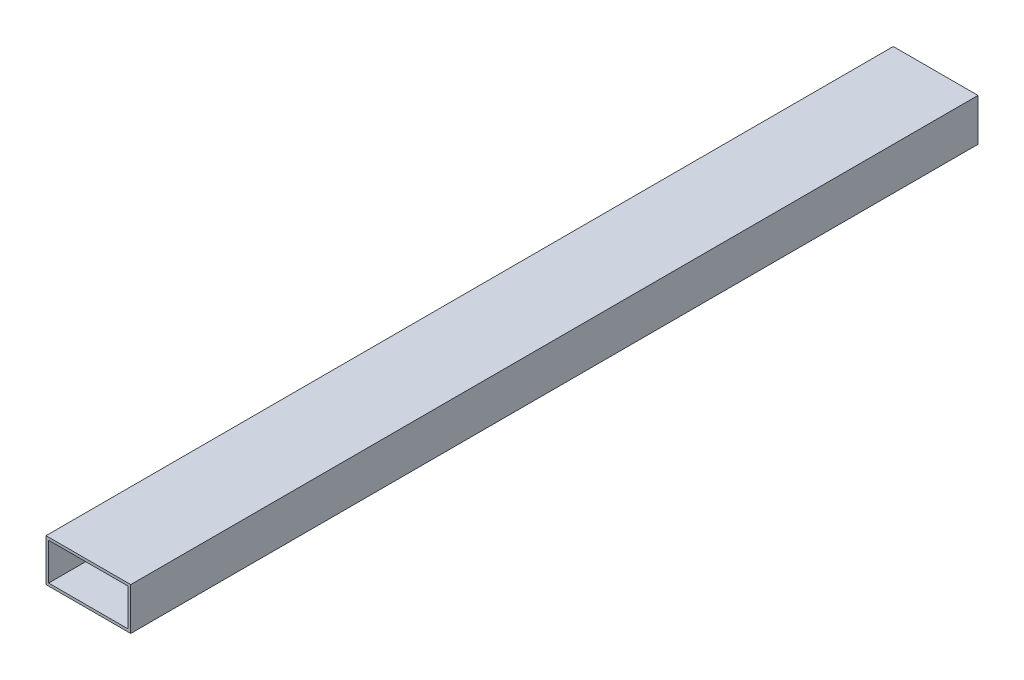
ISO-10303-21;
HEADER;
FILE_DESCRIPTION(('STEP AP214'),'2;1');
FILE_NAME('part.step','',(''),(''),'','','');
FILE_SCHEMA(('AUTOMOTIVE_DESIGN { 1 0 10303 214 1 1 1 1 }'));
ENDSEC;
DATA;
#1=APPLICATION_CONTEXT('core data for automotive mechanical design processes');
#2=APPLICATION_PROTOCOL_DEFINITION('international standard','automotive_design',2000,#1);
#3=PRODUCT_CONTEXT('',#1,'mechanical');
#4=PRODUCT('Part','Part','',(#3));
#5=PRODUCT_RELATED_PRODUCT_CATEGORY('part','',(#4));
#6=PRODUCT_DEFINITION_FORMATION('','',#4);
#7=PRODUCT_DEFINITION_CONTEXT('part definition',#1,'design');
#8=PRODUCT_DEFINITION('design','',#6,#7);
#9=PRODUCT_DEFINITION_SHAPE('','',#8);
#10=(LENGTH_UNIT() NAMED_UNIT(*) SI_UNIT(.MILLI.,.METRE.));
#11=(NAMED_UNIT(*) PLANE_ANGLE_UNIT() SI_UNIT($,.RADIAN.));
#12=(NAMED_UNIT(*) SI_UNIT($,.STERADIAN.) SOLID_ANGLE_UNIT());
#13=UNCERTAINTY_MEASURE_WITH_UNIT(LENGTH_MEASURE(1.E-05),#10,'distance_accuracy_value','');
#14=(GEOMETRIC_REPRESENTATION_CONTEXT(3) GLOBAL_UNCERTAINTY_ASSIGNED_CONTEXT((#13)) GLOBAL_UNIT_ASSIGNED_CONTEXT((#10,
#11,#12)) REPRESENTATION_CONTEXT('',''));
#15=CARTESIAN_POINT('',(0.,0.,0.));
#16=DIRECTION('',(0.,0.,1.));
#17=DIRECTION('',(1.,0.,0.));
#18=AXIS2_PLACEMENT_3D('',#15,#16,#17);
#19=CARTESIAN_POINT('',(0.,0.,508.));
#20=DIRECTION('',(0.,0.,-1.));
#21=DIRECTION('',(-1.,0.,0.));
#22=AXIS2_PLACEMENT_3D('',#19,#20,#21);
#23=PLANE('',#22);
#24=DIRECTION('',(0.,-1.,0.));
#25=VECTOR('',#24,1.);
#26=CARTESIAN_POINT('',(0.,0.,508.));
#27=LINE('',#26,#25);
#28=CARTESIAN_POINT('',(0.,25.4,508.));
#29=VERTEX_POINT('',#28);
#30=CARTESIAN_POINT('',(0.,0.,508.));
#31=VERTEX_POINT('',#30);
#32=EDGE_CURVE('E136',#29,#31,#27,.T.);
#33=ORIENTED_EDGE('',*,*,#32,.T.);
#34=DIRECTION('',(1.,0.,0.));
#35=VECTOR('',#34,1.);
#36=CARTESIAN_POINT('',(0.,0.,508.));
#37=LINE('',#36,#35);
#38=CARTESIAN_POINT('',(50.8,0.,508.));
#39=VERTEX_POINT('',#38);
#40=EDGE_CURVE('E139',#31,#39,#37,.T.);
#41=ORIENTED_EDGE('',*,*,#40,.T.);
#42=DIRECTION('',(0.,1.,0.));
#43=VECTOR('',#42,1.);
#44=CARTESIAN_POINT('',(50.8,0.,508.));
#45=LINE('',#44,#43);
#46=CARTESIAN_POINT('',(50.8,25.4,508.));
#47=VERTEX_POINT('',#46);
#48=EDGE_CURVE('E142',#39,#47,#45,.T.);
#49=ORIENTED_EDGE('',*,*,#48,.T.);
#50=DIRECTION('',(-1.,0.,0.));
#51=VECTOR('',#50,1.);
#52=CARTESIAN_POINT('',(0.,25.4,508.));
#53=LINE('',#52,#51);
#54=EDGE_CURVE('E144',#47,#29,#53,.T.);
#55=ORIENTED_EDGE('',*,*,#54,.T.);
#56=EDGE_LOOP('',(#33,#41,#49,#55));
#57=FACE_BOUND('',#56,.T.);
#58=DIRECTION('',(0.,-1.,0.));
#59=VECTOR('',#58,1.);
#60=CARTESIAN_POINT('',(1.5875,1.5875,508.));
#61=LINE('',#60,#59);
#62=CARTESIAN_POINT('',(1.5875,23.8125,508.));
#63=VERTEX_POINT('',#62);
#64=CARTESIAN_POINT('',(1.5875,1.5875,508.));
#65=VERTEX_POINT('',#64);
#66=EDGE_CURVE('E100',#63,#65,#61,.T.);
#67=ORIENTED_EDGE('',*,*,#66,.F.);
#68=DIRECTION('',(-1.,0.,0.));
#69=VECTOR('',#68,1.);
#70=CARTESIAN_POINT('',(1.5875,23.8125,508.));
#71=LINE('',#70,#69);
#72=CARTESIAN_POINT('',(49.2125,23.8125,508.));
#73=VERTEX_POINT('',#72);
#74=EDGE_CURVE('E122',#73,#63,#71,.T.);
#75=ORIENTED_EDGE('',*,*,#74,.F.);
#76=DIRECTION('',(0.,1.,0.));
#77=VECTOR('',#76,1.);
#78=CARTESIAN_POINT('',(49.2125,1.5875,508.));
#79=LINE('',#78,#77);
#80=CARTESIAN_POINT('',(49.2125,1.5875,508.));
#81=VERTEX_POINT('',#80);
#82=EDGE_CURVE('E120',#81,#73,#79,.T.);
#83=ORIENTED_EDGE('',*,*,#82,.F.);
#84=DIRECTION('',(1.,0.,0.));
#85=VECTOR('',#84,1.);
#86=CARTESIAN_POINT('',(1.5875,1.5875,508.));
#87=LINE('',#86,#85);
#88=EDGE_CURVE('E108',#65,#81,#87,.T.);
#89=ORIENTED_EDGE('',*,*,#88,.F.);
#90=EDGE_LOOP('',(#67,#75,#83,#89));
#91=FACE_BOUND('',#90,.T.);
#92=ADVANCED_FACE('F35',(#57,#91),#23,.F.);
#93=CARTESIAN_POINT('',(0.,0.,0.));
#94=DIRECTION('',(0.,0.,-1.));
#95=DIRECTION('',(-1.,0.,0.));
#96=AXIS2_PLACEMENT_3D('',#93,#94,#95);
#97=PLANE('',#96);
#98=DIRECTION('',(0.,-1.,0.));
#99=VECTOR('',#98,1.);
#100=CARTESIAN_POINT('',(0.,0.,0.));
#101=LINE('',#100,#99);
#102=CARTESIAN_POINT('',(0.,25.4,0.));
#103=VERTEX_POINT('',#102);
#104=CARTESIAN_POINT('',(0.,0.,0.));
#105=VERTEX_POINT('',#104);
#106=EDGE_CURVE('E116',#103,#105,#101,.T.);
#107=ORIENTED_EDGE('',*,*,#106,.F.);
#108=DIRECTION('',(-1.,0.,0.));
#109=VECTOR('',#108,1.);
#110=CARTESIAN_POINT('',(0.,25.4,0.));
#111=LINE('',#110,#109);
#112=CARTESIAN_POINT('',(50.8,25.4,0.));
#113=VERTEX_POINT('',#112);
#114=EDGE_CURVE('E140',#113,#103,#111,.T.);
#115=ORIENTED_EDGE('',*,*,#114,.F.);
#116=DIRECTION('',(0.,1.,0.));
#117=VECTOR('',#116,1.);
#118=CARTESIAN_POINT('',(50.8,0.,0.));
#119=LINE('',#118,#117);
#120=CARTESIAN_POINT('',(50.8,0.,0.));
#121=VERTEX_POINT('',#120);
#122=EDGE_CURVE('E151',#121,#113,#119,.T.);
#123=ORIENTED_EDGE('',*,*,#122,.F.);
#124=DIRECTION('',(1.,0.,0.));
#125=VECTOR('',#124,1.);
#126=CARTESIAN_POINT('',(0.,0.,0.));
#127=LINE('',#126,#125);
#128=EDGE_CURVE('E149',#105,#121,#127,.T.);
#129=ORIENTED_EDGE('',*,*,#128,.F.);
#130=EDGE_LOOP('',(#107,#115,#123,#129));
#131=FACE_BOUND('',#130,.T.);
#132=DIRECTION('',(-1.,0.,0.));
#133=VECTOR('',#132,1.);
#134=CARTESIAN_POINT('',(1.5875,23.8125,0.));
#135=LINE('',#134,#133);
#136=CARTESIAN_POINT('',(49.2125,23.8125,0.));
#137=VERTEX_POINT('',#136);
#138=CARTESIAN_POINT('',(1.5875,23.8125,0.));
#139=VERTEX_POINT('',#138);
#140=EDGE_CURVE('E109',#137,#139,#135,.T.);
#141=ORIENTED_EDGE('',*,*,#140,.T.);
#142=DIRECTION('',(0.,-1.,0.));
#143=VECTOR('',#142,1.);
#144=CARTESIAN_POINT('',(1.5875,1.5875,0.));
#145=LINE('',#144,#143);
#146=CARTESIAN_POINT('',(1.5875,1.5875,0.));
#147=VERTEX_POINT('',#146);
#148=EDGE_CURVE('E58',#139,#147,#145,.T.);
#149=ORIENTED_EDGE('',*,*,#148,.T.);
#150=DIRECTION('',(1.,0.,0.));
#151=VECTOR('',#150,1.);
#152=CARTESIAN_POINT('',(1.5875,1.5875,0.));
#153=LINE('',#152,#151);
#154=CARTESIAN_POINT('',(49.2125,1.5875,0.));
#155=VERTEX_POINT('',#154);
#156=EDGE_CURVE('E115',#147,#155,#153,.T.);
#157=ORIENTED_EDGE('',*,*,#156,.T.);
#158=DIRECTION('',(0.,1.,0.));
#159=VECTOR('',#158,1.);
#160=CARTESIAN_POINT('',(49.2125,1.5875,0.));
#161=LINE('',#160,#159);
#162=EDGE_CURVE('E128',#155,#137,#161,.T.);
#163=ORIENTED_EDGE('',*,*,#162,.T.);
#164=EDGE_LOOP('',(#141,#149,#157,#163));
#165=FACE_BOUND('',#164,.T.);
#166=ADVANCED_FACE('F169',(#131,#165),#97,.T.);
#167=CARTESIAN_POINT('',(0.,0.,508.));
#168=DIRECTION('',(1.,0.,0.));
#169=DIRECTION('',(0.,0.,-1.));
#170=AXIS2_PLACEMENT_3D('',#167,#168,#169);
#171=PLANE('',#170);
#172=ORIENTED_EDGE('',*,*,#106,.T.);
#173=DIRECTION('',(0.,0.,-1.));
#174=VECTOR('',#173,1.);
#175=CARTESIAN_POINT('',(0.,0.,508.));
#176=LINE('',#175,#174);
#177=EDGE_CURVE('E11',#31,#105,#176,.T.);
#178=ORIENTED_EDGE('',*,*,#177,.F.);
#179=ORIENTED_EDGE('',*,*,#32,.F.);
#180=DIRECTION('',(0.,0.,-1.));
#181=VECTOR('',#180,1.);
#182=CARTESIAN_POINT('',(0.,25.4,508.));
#183=LINE('',#182,#181);
#184=EDGE_CURVE('E146',#29,#103,#183,.T.);
#185=ORIENTED_EDGE('',*,*,#184,.T.);
#186=EDGE_LOOP('',(#172,#178,#179,#185));
#187=FACE_BOUND('',#186,.T.);
#188=ADVANCED_FACE('F37',(#187),#171,.F.);
#189=CARTESIAN_POINT('',(0.,0.,508.));
#190=DIRECTION('',(0.,1.,0.));
#191=DIRECTION('',(0.,0.,1.));
#192=AXIS2_PLACEMENT_3D('',#189,#190,#191);
#193=PLANE('',#192);
#194=ORIENTED_EDGE('',*,*,#128,.T.);
#195=DIRECTION('',(0.,0.,-1.));
#196=VECTOR('',#195,1.);
#197=CARTESIAN_POINT('',(50.8,0.,508.));
#198=LINE('',#197,#196);
#199=EDGE_CURVE('E43',#39,#121,#198,.T.);
#200=ORIENTED_EDGE('',*,*,#199,.F.);
#201=ORIENTED_EDGE('',*,*,#40,.F.);
#202=ORIENTED_EDGE('',*,*,#177,.T.);
#203=EDGE_LOOP('',(#194,#200,#201,#202));
#204=FACE_BOUND('',#203,.T.);
#205=ADVANCED_FACE('F179',(#204),#193,.F.);
#206=CARTESIAN_POINT('',(50.8,0.,508.));
#207=DIRECTION('',(-1.,0.,0.));
#208=DIRECTION('',(0.,0.,1.));
#209=AXIS2_PLACEMENT_3D('',#206,#207,#208);
#210=PLANE('',#209);
#211=ORIENTED_EDGE('',*,*,#122,.T.);
#212=DIRECTION('',(0.,0.,-1.));
#213=VECTOR('',#212,1.);
#214=CARTESIAN_POINT('',(50.8,25.4,508.));
#215=LINE('',#214,#213);
#216=EDGE_CURVE('E156',#47,#113,#215,.T.);
#217=ORIENTED_EDGE('',*,*,#216,.F.);
#218=ORIENTED_EDGE('',*,*,#48,.F.);
#219=ORIENTED_EDGE('',*,*,#199,.T.);
#220=EDGE_LOOP('',(#211,#217,#218,#219));
#221=FACE_BOUND('',#220,.T.);
#222=ADVANCED_FACE('F163',(#221),#210,.F.);
#223=CARTESIAN_POINT('',(0.,25.4,508.));
#224=DIRECTION('',(0.,-1.,0.));
#225=DIRECTION('',(0.,0.,-1.));
#226=AXIS2_PLACEMENT_3D('',#223,#224,#225);
#227=PLANE('',#226);
#228=ORIENTED_EDGE('',*,*,#114,.T.);
#229=ORIENTED_EDGE('',*,*,#184,.F.);
#230=ORIENTED_EDGE('',*,*,#54,.F.);
#231=ORIENTED_EDGE('',*,*,#216,.T.);
#232=EDGE_LOOP('',(#228,#229,#230,#231));
#233=FACE_BOUND('',#232,.T.);
#234=ADVANCED_FACE('F173',(#233),#227,.F.);
#235=CARTESIAN_POINT('',(1.5875,1.5875,508.));
#236=DIRECTION('',(1.,0.,0.));
#237=DIRECTION('',(0.,0.,-1.));
#238=AXIS2_PLACEMENT_3D('',#235,#236,#237);
#239=PLANE('',#238);
#240=ORIENTED_EDGE('',*,*,#148,.F.);
#241=DIRECTION('',(0.,0.,-1.));
#242=VECTOR('',#241,1.);
#243=CARTESIAN_POINT('',(1.5875,23.8125,508.));
#244=LINE('',#243,#242);
#245=EDGE_CURVE('E104',#63,#139,#244,.T.);
#246=ORIENTED_EDGE('',*,*,#245,.F.);
#247=ORIENTED_EDGE('',*,*,#66,.T.);
#248=DIRECTION('',(0.,0.,-1.));
#249=VECTOR('',#248,1.);
#250=CARTESIAN_POINT('',(1.5875,1.5875,508.));
#251=LINE('',#250,#249);
#252=EDGE_CURVE('E103',#65,#147,#251,.T.);
#253=ORIENTED_EDGE('',*,*,#252,.T.);
#254=EDGE_LOOP('',(#240,#246,#247,#253));
#255=FACE_BOUND('',#254,.T.);
#256=ADVANCED_FACE('F102',(#255),#239,.T.);
#257=CARTESIAN_POINT('',(1.5875,1.5875,508.));
#258=DIRECTION('',(0.,1.,0.));
#259=DIRECTION('',(0.,0.,1.));
#260=AXIS2_PLACEMENT_3D('',#257,#258,#259);
#261=PLANE('',#260);
#262=ORIENTED_EDGE('',*,*,#156,.F.);
#263=ORIENTED_EDGE('',*,*,#252,.F.);
#264=ORIENTED_EDGE('',*,*,#88,.T.);
#265=DIRECTION('',(0.,0.,-1.));
#266=VECTOR('',#265,1.);
#267=CARTESIAN_POINT('',(49.2125,1.5875,508.));
#268=LINE('',#267,#266);
#269=EDGE_CURVE('E117',#81,#155,#268,.T.);
#270=ORIENTED_EDGE('',*,*,#269,.T.);
#271=EDGE_LOOP('',(#262,#263,#264,#270));
#272=FACE_BOUND('',#271,.T.);
#273=ADVANCED_FACE('F112',(#272),#261,.T.);
#274=CARTESIAN_POINT('',(49.2125,1.5875,508.));
#275=DIRECTION('',(-1.,0.,0.));
#276=DIRECTION('',(0.,0.,1.));
#277=AXIS2_PLACEMENT_3D('',#274,#275,#276);
#278=PLANE('',#277);
#279=ORIENTED_EDGE('',*,*,#162,.F.);
#280=ORIENTED_EDGE('',*,*,#269,.F.);
#281=ORIENTED_EDGE('',*,*,#82,.T.);
#282=DIRECTION('',(0.,0.,-1.));
#283=VECTOR('',#282,1.);
#284=CARTESIAN_POINT('',(49.2125,23.8125,508.));
#285=LINE('',#284,#283);
#286=EDGE_CURVE('E50',#73,#137,#285,.T.);
#287=ORIENTED_EDGE('',*,*,#286,.T.);
#288=EDGE_LOOP('',(#279,#280,#281,#287));
#289=FACE_BOUND('',#288,.T.);
#290=ADVANCED_FACE('F202',(#289),#278,.T.);
#291=CARTESIAN_POINT('',(1.5875,23.8125,508.));
#292=DIRECTION('',(0.,-1.,0.));
#293=DIRECTION('',(0.,0.,-1.));
#294=AXIS2_PLACEMENT_3D('',#291,#292,#293);
#295=PLANE('',#294);
#296=ORIENTED_EDGE('',*,*,#140,.F.);
#297=ORIENTED_EDGE('',*,*,#286,.F.);
#298=ORIENTED_EDGE('',*,*,#74,.T.);
#299=ORIENTED_EDGE('',*,*,#245,.T.);
#300=EDGE_LOOP('',(#296,#297,#298,#299));
#301=FACE_BOUND('',#300,.T.);
#302=ADVANCED_FACE('F206',(#301),#295,.T.);
#303=CLOSED_SHELL('',(#92,#166,#188,#205,#222,#234,#256,#273,#290,#302));
#304=MANIFOLD_SOLID_BREP('B2',#303);
#305=ADVANCED_BREP_SHAPE_REPRESENTATION('',(#18,#304),#14);
#306=SHAPE_DEFINITION_REPRESENTATION(#9,#305);
ENDSEC;
END-ISO-10303-21;
